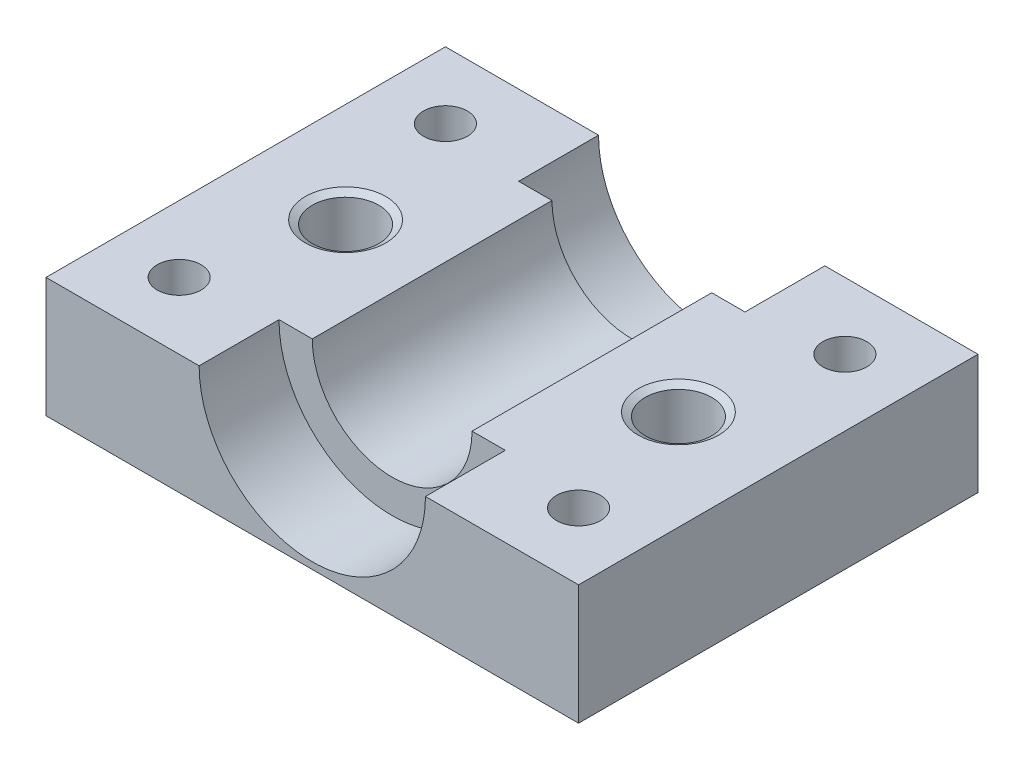
ISO-10303-21;
HEADER;
FILE_DESCRIPTION(('STEP AP214'),'2;1');
FILE_NAME('part.step','',(''),(''),'','','');
FILE_SCHEMA(('AUTOMOTIVE_DESIGN { 1 0 10303 214 1 1 1 1 }'));
ENDSEC;
DATA;
#1=APPLICATION_CONTEXT('core data for automotive mechanical design processes');
#2=APPLICATION_PROTOCOL_DEFINITION('international standard','automotive_design',2000,#1);
#3=PRODUCT_CONTEXT('',#1,'mechanical');
#4=PRODUCT('Part','Part','',(#3));
#5=PRODUCT_RELATED_PRODUCT_CATEGORY('part','',(#4));
#6=PRODUCT_DEFINITION_FORMATION('','',#4);
#7=PRODUCT_DEFINITION_CONTEXT('part definition',#1,'design');
#8=PRODUCT_DEFINITION('design','',#6,#7);
#9=PRODUCT_DEFINITION_SHAPE('','',#8);
#10=(LENGTH_UNIT() NAMED_UNIT(*) SI_UNIT(.MILLI.,.METRE.));
#11=(NAMED_UNIT(*) PLANE_ANGLE_UNIT() SI_UNIT($,.RADIAN.));
#12=(NAMED_UNIT(*) SI_UNIT($,.STERADIAN.) SOLID_ANGLE_UNIT());
#13=UNCERTAINTY_MEASURE_WITH_UNIT(LENGTH_MEASURE(1.E-05),#10,'distance_accuracy_value','');
#14=(GEOMETRIC_REPRESENTATION_CONTEXT(3) GLOBAL_UNCERTAINTY_ASSIGNED_CONTEXT((#13)) GLOBAL_UNIT_ASSIGNED_CONTEXT((#10,
#11,#12)) REPRESENTATION_CONTEXT('',''));
#15=CARTESIAN_POINT('',(0.,0.,0.));
#16=DIRECTION('',(0.,0.,1.));
#17=DIRECTION('',(1.,0.,0.));
#18=AXIS2_PLACEMENT_3D('',#15,#16,#17);
#19=CARTESIAN_POINT('',(20.,9.,-6.));
#20=DIRECTION('',(0.,0.,1.));
#21=DIRECTION('',(1.,0.,0.));
#22=AXIS2_PLACEMENT_3D('',#19,#20,#21);
#23=CYLINDRICAL_SURFACE('',#22,8.5);
#24=DIRECTION('',(0.,0.,1.));
#25=VECTOR('',#24,1.);
#26=CARTESIAN_POINT('',(11.5,9.,-6.));
#27=LINE('',#26,#25);
#28=CARTESIAN_POINT('',(11.5,9.,-6.));
#29=VERTEX_POINT('',#28);
#30=CARTESIAN_POINT('',(11.5,9.00000000000001,0.));
#31=VERTEX_POINT('',#30);
#32=EDGE_CURVE('E50',#29,#31,#27,.T.);
#33=ORIENTED_EDGE('',*,*,#32,.T.);
#34=CARTESIAN_POINT('',(20.,9.,0.));
#35=DIRECTION('',(0.,0.,1.));
#36=DIRECTION('',(1.,0.,0.));
#37=AXIS2_PLACEMENT_3D('',#34,#35,#36);
#38=CIRCLE('',#37,8.5);
#39=CARTESIAN_POINT('',(28.5,9.,0.));
#40=VERTEX_POINT('',#39);
#41=EDGE_CURVE('E143',#31,#40,#38,.T.);
#42=ORIENTED_EDGE('',*,*,#41,.T.);
#43=DIRECTION('',(0.,0.,1.));
#44=VECTOR('',#43,1.);
#45=CARTESIAN_POINT('',(28.5,9.,-6.));
#46=LINE('',#45,#44);
#47=CARTESIAN_POINT('',(28.5,9.,-6.));
#48=VERTEX_POINT('',#47);
#49=EDGE_CURVE('E191',#48,#40,#46,.T.);
#50=ORIENTED_EDGE('',*,*,#49,.F.);
#51=CARTESIAN_POINT('',(20.,9.,-6.));
#52=DIRECTION('',(0.,0.,-1.));
#53=DIRECTION('',(1.,0.,0.));
#54=AXIS2_PLACEMENT_3D('',#51,#52,#53);
#55=CIRCLE('',#54,8.5);
#56=EDGE_CURVE('E181',#48,#29,#55,.T.);
#57=ORIENTED_EDGE('',*,*,#56,.T.);
#58=EDGE_LOOP('',(#33,#42,#50,#57));
#59=FACE_BOUND('',#58,.T.);
#60=ADVANCED_FACE('F41',(#59),#23,.F.);
#61=CARTESIAN_POINT('',(0.,0.,-6.));
#62=DIRECTION('',(-1.,0.,0.));
#63=DIRECTION('',(0.,0.,1.));
#64=AXIS2_PLACEMENT_3D('',#61,#62,#63);
#65=PLANE('',#64);
#66=DIRECTION('',(0.,0.,1.));
#67=VECTOR('',#66,1.);
#68=CARTESIAN_POINT('',(0.,0.,-6.));
#69=LINE('',#68,#67);
#70=CARTESIAN_POINT('',(0.,0.,-6.));
#71=VERTEX_POINT('',#70);
#72=CARTESIAN_POINT('',(0.,0.,24.));
#73=VERTEX_POINT('',#72);
#74=EDGE_CURVE('E186',#71,#73,#69,.T.);
#75=ORIENTED_EDGE('',*,*,#74,.T.);
#76=DIRECTION('',(0.,-1.,0.));
#77=VECTOR('',#76,1.);
#78=CARTESIAN_POINT('',(0.,0.,24.));
#79=LINE('',#78,#77);
#80=CARTESIAN_POINT('',(0.,9.,24.));
#81=VERTEX_POINT('',#80);
#82=EDGE_CURVE('E132',#81,#73,#79,.T.);
#83=ORIENTED_EDGE('',*,*,#82,.F.);
#84=DIRECTION('',(0.,0.,1.));
#85=VECTOR('',#84,1.);
#86=CARTESIAN_POINT('',(0.,9.,-6.));
#87=LINE('',#86,#85);
#88=CARTESIAN_POINT('',(0.,9.,-6.));
#89=VERTEX_POINT('',#88);
#90=EDGE_CURVE('E11',#89,#81,#87,.T.);
#91=ORIENTED_EDGE('',*,*,#90,.F.);
#92=DIRECTION('',(0.,-1.,0.));
#93=VECTOR('',#92,1.);
#94=CARTESIAN_POINT('',(0.,0.,-6.));
#95=LINE('',#94,#93);
#96=EDGE_CURVE('E170',#89,#71,#95,.T.);
#97=ORIENTED_EDGE('',*,*,#96,.T.);
#98=EDGE_LOOP('',(#75,#83,#91,#97));
#99=FACE_BOUND('',#98,.T.);
#100=ADVANCED_FACE('F43',(#99),#65,.T.);
#101=CARTESIAN_POINT('',(0.,9.,-6.));
#102=DIRECTION('',(0.,1.,0.));
#103=DIRECTION('',(0.,0.,1.));
#104=AXIS2_PLACEMENT_3D('',#101,#102,#103);
#105=PLANE('',#104);
#106=CARTESIAN_POINT('',(7.5,9.,9.00000000000001));
#107=DIRECTION('',(0.,1.,0.));
#108=DIRECTION('',(0.,0.,1.));
#109=AXIS2_PLACEMENT_3D('',#106,#107,#108);
#110=CIRCLE('',#109,3.025);
#111=CARTESIAN_POINT('',(7.5,9.,12.025));
#112=VERTEX_POINT('',#111);
#113=EDGE_CURVE('E225',#112,#112,#110,.T.);
#114=ORIENTED_EDGE('',*,*,#113,.F.);
#115=EDGE_LOOP('',(#114));
#116=FACE_BOUND('',#115,.T.);
#117=CARTESIAN_POINT('',(5.,9.,19.));
#118=DIRECTION('',(0.,1.,0.));
#119=DIRECTION('',(0.,0.,1.));
#120=AXIS2_PLACEMENT_3D('',#117,#118,#119);
#121=CIRCLE('',#120,1.65);
#122=CARTESIAN_POINT('',(5.,9.,20.65));
#123=VERTEX_POINT('',#122);
#124=EDGE_CURVE('E202',#123,#123,#121,.T.);
#125=ORIENTED_EDGE('',*,*,#124,.F.);
#126=EDGE_LOOP('',(#125));
#127=FACE_BOUND('',#126,.T.);
#128=CARTESIAN_POINT('',(5.,9.,-1.));
#129=DIRECTION('',(0.,1.,0.));
#130=DIRECTION('',(0.,0.,1.));
#131=AXIS2_PLACEMENT_3D('',#128,#129,#130);
#132=CIRCLE('',#131,1.65);
#133=CARTESIAN_POINT('',(5.,9.,0.649999999999993));
#134=VERTEX_POINT('',#133);
#135=EDGE_CURVE('E146',#134,#134,#132,.T.);
#136=ORIENTED_EDGE('',*,*,#135,.F.);
#137=EDGE_LOOP('',(#136));
#138=FACE_BOUND('',#137,.T.);
#139=ORIENTED_EDGE('',*,*,#90,.T.);
#140=DIRECTION('',(-1.,0.,0.));
#141=VECTOR('',#140,1.);
#142=CARTESIAN_POINT('',(0.,9.,24.));
#143=LINE('',#142,#141);
#144=CARTESIAN_POINT('',(11.5,9.,24.));
#145=VERTEX_POINT('',#144);
#146=EDGE_CURVE('E167',#145,#81,#143,.T.);
#147=ORIENTED_EDGE('',*,*,#146,.F.);
#148=CARTESIAN_POINT('',(11.5,9.00000000000001,18.));
#149=VERTEX_POINT('',#148);
#150=EDGE_CURVE('E190',#149,#145,#27,.T.);
#151=ORIENTED_EDGE('',*,*,#150,.F.);
#152=DIRECTION('',(-1.,0.,0.));
#153=VECTOR('',#152,1.);
#154=CARTESIAN_POINT('',(11.5,9.00000000000001,18.));
#155=LINE('',#154,#153);
#156=CARTESIAN_POINT('',(14.,9.,18.));
#157=VERTEX_POINT('',#156);
#158=EDGE_CURVE('E138',#157,#149,#155,.T.);
#159=ORIENTED_EDGE('',*,*,#158,.F.);
#160=DIRECTION('',(0.,0.,-1.));
#161=VECTOR('',#160,1.);
#162=CARTESIAN_POINT('',(14.,9.,18.));
#163=LINE('',#162,#161);
#164=CARTESIAN_POINT('',(14.,9.,0.));
#165=VERTEX_POINT('',#164);
#166=EDGE_CURVE('E133',#157,#165,#163,.T.);
#167=ORIENTED_EDGE('',*,*,#166,.T.);
#168=DIRECTION('',(-1.,0.,0.));
#169=VECTOR('',#168,1.);
#170=CARTESIAN_POINT('',(11.5,9.00000000000001,0.));
#171=LINE('',#170,#169);
#172=EDGE_CURVE('E150',#165,#31,#171,.T.);
#173=ORIENTED_EDGE('',*,*,#172,.T.);
#174=ORIENTED_EDGE('',*,*,#32,.F.);
#175=DIRECTION('',(-1.,0.,0.));
#176=VECTOR('',#175,1.);
#177=CARTESIAN_POINT('',(0.,9.,-6.));
#178=LINE('',#177,#176);
#179=EDGE_CURVE('E184',#29,#89,#178,.T.);
#180=ORIENTED_EDGE('',*,*,#179,.T.);
#181=EDGE_LOOP('',(#139,#147,#151,#159,#167,#173,#174,#180));
#182=FACE_BOUND('',#181,.T.);
#183=ADVANCED_FACE('F281',(#116,#127,#138,#182),#105,.T.);
#184=CARTESIAN_POINT('',(20.,9.,18.));
#185=DIRECTION('',(0.,0.,1.));
#186=DIRECTION('',(1.,0.,0.));
#187=AXIS2_PLACEMENT_3D('',#184,#185,#186);
#188=CIRCLE('',#187,8.5);
#189=CARTESIAN_POINT('',(28.5,9.,18.));
#190=VERTEX_POINT('',#189);
#191=EDGE_CURVE('E58',#149,#190,#188,.T.);
#192=ORIENTED_EDGE('',*,*,#191,.F.);
#193=ORIENTED_EDGE('',*,*,#150,.T.);
#194=CARTESIAN_POINT('',(20.,9.,24.));
#195=DIRECTION('',(0.,0.,-1.));
#196=DIRECTION('',(1.,0.,0.));
#197=AXIS2_PLACEMENT_3D('',#194,#195,#196);
#198=CIRCLE('',#197,8.5);
#199=CARTESIAN_POINT('',(28.5,9.,24.));
#200=VERTEX_POINT('',#199);
#201=EDGE_CURVE('E164',#200,#145,#198,.T.);
#202=ORIENTED_EDGE('',*,*,#201,.F.);
#203=EDGE_CURVE('E193',#190,#200,#46,.T.);
#204=ORIENTED_EDGE('',*,*,#203,.F.);
#205=EDGE_LOOP('',(#192,#193,#202,#204));
#206=FACE_BOUND('',#205,.T.);
#207=ADVANCED_FACE('F285',(#206),#23,.F.);
#208=CARTESIAN_POINT('',(28.5,9.,-6.));
#209=DIRECTION('',(0.,1.,0.));
#210=DIRECTION('',(-1.,0.,0.));
#211=AXIS2_PLACEMENT_3D('',#208,#209,#210);
#212=PLANE('',#211);
#213=CARTESIAN_POINT('',(32.5,9.00000000000001,9.));
#214=DIRECTION('',(0.,1.,0.));
#215=DIRECTION('',(0.,0.,1.));
#216=AXIS2_PLACEMENT_3D('',#213,#214,#215);
#217=CIRCLE('',#216,3.025);
#218=CARTESIAN_POINT('',(32.5,9.00000000000001,12.025));
#219=VERTEX_POINT('',#218);
#220=EDGE_CURVE('E310',#219,#219,#217,.T.);
#221=ORIENTED_EDGE('',*,*,#220,.F.);
#222=EDGE_LOOP('',(#221));
#223=FACE_BOUND('',#222,.T.);
#224=CARTESIAN_POINT('',(35.,9.00000000000001,19.));
#225=DIRECTION('',(0.,1.,0.));
#226=DIRECTION('',(-1.,0.,0.));
#227=AXIS2_PLACEMENT_3D('',#224,#225,#226);
#228=CIRCLE('',#227,1.65);
#229=CARTESIAN_POINT('',(33.35,9.00000000000001,19.));
#230=VERTEX_POINT('',#229);
#231=EDGE_CURVE('E212',#230,#230,#228,.T.);
#232=ORIENTED_EDGE('',*,*,#231,.F.);
#233=EDGE_LOOP('',(#232));
#234=FACE_BOUND('',#233,.T.);
#235=CARTESIAN_POINT('',(35.,9.00000000000001,-1.));
#236=DIRECTION('',(0.,1.,0.));
#237=DIRECTION('',(-1.,0.,0.));
#238=AXIS2_PLACEMENT_3D('',#235,#236,#237);
#239=CIRCLE('',#238,1.65);
#240=CARTESIAN_POINT('',(33.35,9.00000000000001,-1.));
#241=VERTEX_POINT('',#240);
#242=EDGE_CURVE('E207',#241,#241,#239,.T.);
#243=ORIENTED_EDGE('',*,*,#242,.F.);
#244=EDGE_LOOP('',(#243));
#245=FACE_BOUND('',#244,.T.);
#246=ORIENTED_EDGE('',*,*,#49,.T.);
#247=DIRECTION('',(-1.,0.,0.));
#248=VECTOR('',#247,1.);
#249=CARTESIAN_POINT('',(26.,9.,0.));
#250=LINE('',#249,#248);
#251=CARTESIAN_POINT('',(26.,9.,0.));
#252=VERTEX_POINT('',#251);
#253=EDGE_CURVE('E129',#40,#252,#250,.T.);
#254=ORIENTED_EDGE('',*,*,#253,.T.);
#255=DIRECTION('',(0.,0.,-1.));
#256=VECTOR('',#255,1.);
#257=CARTESIAN_POINT('',(26.,9.,18.));
#258=LINE('',#257,#256);
#259=CARTESIAN_POINT('',(26.,9.,18.));
#260=VERTEX_POINT('',#259);
#261=EDGE_CURVE('E126',#260,#252,#258,.T.);
#262=ORIENTED_EDGE('',*,*,#261,.F.);
#263=DIRECTION('',(-1.,0.,0.));
#264=VECTOR('',#263,1.);
#265=CARTESIAN_POINT('',(26.,9.,18.));
#266=LINE('',#265,#264);
#267=EDGE_CURVE('E116',#190,#260,#266,.T.);
#268=ORIENTED_EDGE('',*,*,#267,.F.);
#269=ORIENTED_EDGE('',*,*,#203,.T.);
#270=DIRECTION('',(-1.,0.,0.));
#271=VECTOR('',#270,1.);
#272=CARTESIAN_POINT('',(28.5,9.,24.));
#273=LINE('',#272,#271);
#274=CARTESIAN_POINT('',(40.,9.00000000000001,24.));
#275=VERTEX_POINT('',#274);
#276=EDGE_CURVE('E161',#275,#200,#273,.T.);
#277=ORIENTED_EDGE('',*,*,#276,.F.);
#278=DIRECTION('',(0.,0.,1.));
#279=VECTOR('',#278,1.);
#280=CARTESIAN_POINT('',(40.,9.00000000000001,-6.));
#281=LINE('',#280,#279);
#282=CARTESIAN_POINT('',(40.,9.00000000000001,-6.));
#283=VERTEX_POINT('',#282);
#284=EDGE_CURVE('E194',#283,#275,#281,.T.);
#285=ORIENTED_EDGE('',*,*,#284,.F.);
#286=DIRECTION('',(-1.,0.,0.));
#287=VECTOR('',#286,1.);
#288=CARTESIAN_POINT('',(28.5,9.,-6.));
#289=LINE('',#288,#287);
#290=EDGE_CURVE('E178',#283,#48,#289,.T.);
#291=ORIENTED_EDGE('',*,*,#290,.T.);
#292=EDGE_LOOP('',(#246,#254,#262,#268,#269,#277,#285,#291));
#293=FACE_BOUND('',#292,.T.);
#294=ADVANCED_FACE('F128',(#223,#234,#245,#293),#212,.T.);
#295=CARTESIAN_POINT('',(40.,0.,-6.));
#296=DIRECTION('',(1.,0.,0.));
#297=DIRECTION('',(0.,0.,-1.));
#298=AXIS2_PLACEMENT_3D('',#295,#296,#297);
#299=PLANE('',#298);
#300=ORIENTED_EDGE('',*,*,#284,.T.);
#301=DIRECTION('',(0.,1.,0.));
#302=VECTOR('',#301,1.);
#303=CARTESIAN_POINT('',(40.,0.,24.));
#304=LINE('',#303,#302);
#305=CARTESIAN_POINT('',(40.,0.,24.));
#306=VERTEX_POINT('',#305);
#307=EDGE_CURVE('E158',#306,#275,#304,.T.);
#308=ORIENTED_EDGE('',*,*,#307,.F.);
#309=DIRECTION('',(0.,0.,1.));
#310=VECTOR('',#309,1.);
#311=CARTESIAN_POINT('',(40.,0.,-6.));
#312=LINE('',#311,#310);
#313=CARTESIAN_POINT('',(40.,0.,-6.));
#314=VERTEX_POINT('',#313);
#315=EDGE_CURVE('E196',#314,#306,#312,.T.);
#316=ORIENTED_EDGE('',*,*,#315,.F.);
#317=DIRECTION('',(0.,1.,0.));
#318=VECTOR('',#317,1.);
#319=CARTESIAN_POINT('',(40.,0.,-6.));
#320=LINE('',#319,#318);
#321=EDGE_CURVE('E175',#314,#283,#320,.T.);
#322=ORIENTED_EDGE('',*,*,#321,.T.);
#323=EDGE_LOOP('',(#300,#308,#316,#322));
#324=FACE_BOUND('',#323,.T.);
#325=ADVANCED_FACE('F261',(#324),#299,.T.);
#326=CARTESIAN_POINT('',(0.,0.,-6.));
#327=DIRECTION('',(0.,-1.,0.));
#328=DIRECTION('',(1.,0.,0.));
#329=AXIS2_PLACEMENT_3D('',#326,#327,#328);
#330=PLANE('',#329);
#331=CARTESIAN_POINT('',(32.5,0.,9.));
#332=DIRECTION('',(0.,-1.,0.));
#333=DIRECTION('',(1.,0.,0.));
#334=AXIS2_PLACEMENT_3D('',#331,#332,#333);
#335=CIRCLE('',#334,2.5);
#336=CARTESIAN_POINT('',(35.,0.,9.));
#337=VERTEX_POINT('',#336);
#338=EDGE_CURVE('E45',#337,#337,#335,.T.);
#339=ORIENTED_EDGE('',*,*,#338,.F.);
#340=EDGE_LOOP('',(#339));
#341=FACE_BOUND('',#340,.T.);
#342=CARTESIAN_POINT('',(7.5,0.,9.00000000000001));
#343=DIRECTION('',(0.,-1.,0.));
#344=DIRECTION('',(1.,0.,0.));
#345=AXIS2_PLACEMENT_3D('',#342,#343,#344);
#346=CIRCLE('',#345,2.5);
#347=CARTESIAN_POINT('',(10.,0.,9.00000000000001));
#348=VERTEX_POINT('',#347);
#349=EDGE_CURVE('E216',#348,#348,#346,.T.);
#350=ORIENTED_EDGE('',*,*,#349,.F.);
#351=EDGE_LOOP('',(#350));
#352=FACE_BOUND('',#351,.T.);
#353=CARTESIAN_POINT('',(35.,0.,19.));
#354=DIRECTION('',(0.,-1.,0.));
#355=DIRECTION('',(0.,0.,-1.));
#356=AXIS2_PLACEMENT_3D('',#353,#354,#355);
#357=CIRCLE('',#356,2.025);
#358=CARTESIAN_POINT('',(35.,0.,16.975));
#359=VERTEX_POINT('',#358);
#360=EDGE_CURVE('E218',#359,#359,#357,.T.);
#361=ORIENTED_EDGE('',*,*,#360,.F.);
#362=EDGE_LOOP('',(#361));
#363=FACE_BOUND('',#362,.T.);
#364=CARTESIAN_POINT('',(35.,0.,-1.));
#365=DIRECTION('',(0.,-1.,0.));
#366=DIRECTION('',(0.,0.,-1.));
#367=AXIS2_PLACEMENT_3D('',#364,#365,#366);
#368=CIRCLE('',#367,2.025);
#369=CARTESIAN_POINT('',(35.,0.,-3.025));
#370=VERTEX_POINT('',#369);
#371=EDGE_CURVE('E214',#370,#370,#368,.T.);
#372=ORIENTED_EDGE('',*,*,#371,.F.);
#373=EDGE_LOOP('',(#372));
#374=FACE_BOUND('',#373,.T.);
#375=CARTESIAN_POINT('',(5.,0.,19.));
#376=DIRECTION('',(0.,-1.,0.));
#377=DIRECTION('',(0.,0.,-1.));
#378=AXIS2_PLACEMENT_3D('',#375,#376,#377);
#379=CIRCLE('',#378,2.025);
#380=CARTESIAN_POINT('',(5.,0.,16.975));
#381=VERTEX_POINT('',#380);
#382=EDGE_CURVE('E210',#381,#381,#379,.T.);
#383=ORIENTED_EDGE('',*,*,#382,.F.);
#384=EDGE_LOOP('',(#383));
#385=FACE_BOUND('',#384,.T.);
#386=CARTESIAN_POINT('',(5.,0.,-1.));
#387=DIRECTION('',(0.,-1.,0.));
#388=DIRECTION('',(0.,0.,-1.));
#389=AXIS2_PLACEMENT_3D('',#386,#387,#388);
#390=CIRCLE('',#389,2.025);
#391=CARTESIAN_POINT('',(5.,0.,-3.025));
#392=VERTEX_POINT('',#391);
#393=EDGE_CURVE('E205',#392,#392,#390,.T.);
#394=ORIENTED_EDGE('',*,*,#393,.F.);
#395=EDGE_LOOP('',(#394));
#396=FACE_BOUND('',#395,.T.);
#397=ORIENTED_EDGE('',*,*,#315,.T.);
#398=DIRECTION('',(1.,0.,0.));
#399=VECTOR('',#398,1.);
#400=CARTESIAN_POINT('',(0.,0.,24.));
#401=LINE('',#400,#399);
#402=EDGE_CURVE('E155',#73,#306,#401,.T.);
#403=ORIENTED_EDGE('',*,*,#402,.F.);
#404=ORIENTED_EDGE('',*,*,#74,.F.);
#405=DIRECTION('',(1.,0.,0.));
#406=VECTOR('',#405,1.);
#407=CARTESIAN_POINT('',(0.,0.,-6.));
#408=LINE('',#407,#406);
#409=EDGE_CURVE('E172',#71,#314,#408,.T.);
#410=ORIENTED_EDGE('',*,*,#409,.T.);
#411=EDGE_LOOP('',(#397,#403,#404,#410));
#412=FACE_BOUND('',#411,.T.);
#413=ADVANCED_FACE('F257',(#341,#352,#363,#374,#385,#396,#412),#330,.T.);
#414=CARTESIAN_POINT('',(20.,9.,-6.));
#415=DIRECTION('',(0.,0.,1.));
#416=DIRECTION('',(1.,0.,0.));
#417=AXIS2_PLACEMENT_3D('',#414,#415,#416);
#418=PLANE('',#417);
#419=ORIENTED_EDGE('',*,*,#96,.F.);
#420=ORIENTED_EDGE('',*,*,#179,.F.);
#421=ORIENTED_EDGE('',*,*,#56,.F.);
#422=ORIENTED_EDGE('',*,*,#290,.F.);
#423=ORIENTED_EDGE('',*,*,#321,.F.);
#424=ORIENTED_EDGE('',*,*,#409,.F.);
#425=EDGE_LOOP('',(#419,#420,#421,#422,#423,#424));
#426=FACE_BOUND('',#425,.T.);
#427=ADVANCED_FACE('F260',(#426),#418,.F.);
#428=CARTESIAN_POINT('',(20.,9.,24.));
#429=DIRECTION('',(0.,0.,1.));
#430=DIRECTION('',(1.,0.,0.));
#431=AXIS2_PLACEMENT_3D('',#428,#429,#430);
#432=PLANE('',#431);
#433=ORIENTED_EDGE('',*,*,#82,.T.);
#434=ORIENTED_EDGE('',*,*,#402,.T.);
#435=ORIENTED_EDGE('',*,*,#307,.T.);
#436=ORIENTED_EDGE('',*,*,#276,.T.);
#437=ORIENTED_EDGE('',*,*,#201,.T.);
#438=ORIENTED_EDGE('',*,*,#146,.T.);
#439=EDGE_LOOP('',(#433,#434,#435,#436,#437,#438));
#440=FACE_BOUND('',#439,.T.);
#441=ADVANCED_FACE('F269',(#440),#432,.T.);
#442=CARTESIAN_POINT('',(20.,9.,18.));
#443=DIRECTION('',(0.,0.,-1.));
#444=DIRECTION('',(-1.,0.,0.));
#445=AXIS2_PLACEMENT_3D('',#442,#443,#444);
#446=CYLINDRICAL_SURFACE('',#445,6.);
#447=CARTESIAN_POINT('',(20.,9.,0.));
#448=DIRECTION('',(0.,0.,-1.));
#449=DIRECTION('',(1.,0.,0.));
#450=AXIS2_PLACEMENT_3D('',#447,#448,#449);
#451=CIRCLE('',#450,6.);
#452=EDGE_CURVE('E148',#252,#165,#451,.T.);
#453=ORIENTED_EDGE('',*,*,#452,.T.);
#454=ORIENTED_EDGE('',*,*,#166,.F.);
#455=CARTESIAN_POINT('',(20.,9.,18.));
#456=DIRECTION('',(0.,0.,-1.));
#457=DIRECTION('',(1.,0.,0.));
#458=AXIS2_PLACEMENT_3D('',#455,#456,#457);
#459=CIRCLE('',#458,6.);
#460=EDGE_CURVE('E120',#260,#157,#459,.T.);
#461=ORIENTED_EDGE('',*,*,#460,.F.);
#462=ORIENTED_EDGE('',*,*,#261,.T.);
#463=EDGE_LOOP('',(#453,#454,#461,#462));
#464=FACE_BOUND('',#463,.T.);
#465=ADVANCED_FACE('F135',(#464),#446,.F.);
#466=CARTESIAN_POINT('',(20.,9.,18.));
#467=DIRECTION('',(0.,0.,1.));
#468=DIRECTION('',(1.,0.,0.));
#469=AXIS2_PLACEMENT_3D('',#466,#467,#468);
#470=PLANE('',#469);
#471=ORIENTED_EDGE('',*,*,#191,.T.);
#472=ORIENTED_EDGE('',*,*,#267,.T.);
#473=ORIENTED_EDGE('',*,*,#460,.T.);
#474=ORIENTED_EDGE('',*,*,#158,.T.);
#475=EDGE_LOOP('',(#471,#472,#473,#474));
#476=FACE_BOUND('',#475,.T.);
#477=ADVANCED_FACE('F118',(#476),#470,.T.);
#478=CARTESIAN_POINT('',(20.,9.,0.));
#479=DIRECTION('',(0.,0.,1.));
#480=DIRECTION('',(1.,0.,0.));
#481=AXIS2_PLACEMENT_3D('',#478,#479,#480);
#482=PLANE('',#481);
#483=ORIENTED_EDGE('',*,*,#41,.F.);
#484=ORIENTED_EDGE('',*,*,#172,.F.);
#485=ORIENTED_EDGE('',*,*,#452,.F.);
#486=ORIENTED_EDGE('',*,*,#253,.F.);
#487=EDGE_LOOP('',(#483,#484,#485,#486));
#488=FACE_BOUND('',#487,.T.);
#489=ADVANCED_FACE('F279',(#488),#482,.F.);
#490=CARTESIAN_POINT('',(5.,0.,-1.));
#491=DIRECTION('',(0.,-1.,0.));
#492=DIRECTION('',(0.,0.,-1.));
#493=AXIS2_PLACEMENT_3D('',#490,#491,#492);
#494=CYLINDRICAL_SURFACE('',#493,1.65);
#495=ORIENTED_EDGE('',*,*,#135,.T.);
#496=EDGE_LOOP('',(#495));
#497=FACE_BOUND('',#496,.T.);
#498=CARTESIAN_POINT('',(5.,0.216506350946112,-1.));
#499=DIRECTION('',(0.,-1.,0.));
#500=DIRECTION('',(0.,0.,-1.));
#501=AXIS2_PLACEMENT_3D('',#498,#499,#500);
#502=CIRCLE('',#501,1.65);
#503=CARTESIAN_POINT('',(5.,0.216506350946112,-2.65));
#504=VERTEX_POINT('',#503);
#505=EDGE_CURVE('E201',#504,#504,#502,.T.);
#506=ORIENTED_EDGE('',*,*,#505,.T.);
#507=EDGE_LOOP('',(#506));
#508=FACE_BOUND('',#507,.T.);
#509=ADVANCED_FACE('F248',(#497,#508),#494,.F.);
#510=CARTESIAN_POINT('',(5.,0.,-1.));
#511=DIRECTION('',(0.,-1.,0.));
#512=DIRECTION('',(0.,0.,-1.));
#513=AXIS2_PLACEMENT_3D('',#510,#511,#512);
#514=CONICAL_SURFACE('',#513,2.025,1.0471975511966);
#515=ORIENTED_EDGE('',*,*,#505,.F.);
#516=EDGE_LOOP('',(#515));
#517=FACE_BOUND('',#516,.T.);
#518=ORIENTED_EDGE('',*,*,#393,.T.);
#519=EDGE_LOOP('',(#518));
#520=FACE_BOUND('',#519,.T.);
#521=ADVANCED_FACE('F250',(#517,#520),#514,.F.);
#522=CARTESIAN_POINT('',(5.,0.,19.));
#523=DIRECTION('',(0.,-1.,0.));
#524=DIRECTION('',(0.,0.,-1.));
#525=AXIS2_PLACEMENT_3D('',#522,#523,#524);
#526=CYLINDRICAL_SURFACE('',#525,1.65);
#527=ORIENTED_EDGE('',*,*,#124,.T.);
#528=EDGE_LOOP('',(#527));
#529=FACE_BOUND('',#528,.T.);
#530=CARTESIAN_POINT('',(5.,0.216506350946112,19.));
#531=DIRECTION('',(0.,-1.,0.));
#532=DIRECTION('',(0.,0.,-1.));
#533=AXIS2_PLACEMENT_3D('',#530,#531,#532);
#534=CIRCLE('',#533,1.65);
#535=CARTESIAN_POINT('',(5.,0.216506350946112,17.35));
#536=VERTEX_POINT('',#535);
#537=EDGE_CURVE('E206',#536,#536,#534,.T.);
#538=ORIENTED_EDGE('',*,*,#537,.T.);
#539=EDGE_LOOP('',(#538));
#540=FACE_BOUND('',#539,.T.);
#541=ADVANCED_FACE('F253',(#529,#540),#526,.F.);
#542=CARTESIAN_POINT('',(5.,0.,19.));
#543=DIRECTION('',(0.,-1.,0.));
#544=DIRECTION('',(0.,0.,-1.));
#545=AXIS2_PLACEMENT_3D('',#542,#543,#544);
#546=CONICAL_SURFACE('',#545,2.025,1.0471975511966);
#547=ORIENTED_EDGE('',*,*,#537,.F.);
#548=EDGE_LOOP('',(#547));
#549=FACE_BOUND('',#548,.T.);
#550=ORIENTED_EDGE('',*,*,#382,.T.);
#551=EDGE_LOOP('',(#550));
#552=FACE_BOUND('',#551,.T.);
#553=ADVANCED_FACE('F319',(#549,#552),#546,.F.);
#554=CARTESIAN_POINT('',(35.,0.,-1.));
#555=DIRECTION('',(0.,-1.,0.));
#556=DIRECTION('',(0.,0.,-1.));
#557=AXIS2_PLACEMENT_3D('',#554,#555,#556);
#558=CYLINDRICAL_SURFACE('',#557,1.65);
#559=ORIENTED_EDGE('',*,*,#242,.T.);
#560=EDGE_LOOP('',(#559));
#561=FACE_BOUND('',#560,.T.);
#562=CARTESIAN_POINT('',(35.,0.216506350946117,-1.));
#563=DIRECTION('',(0.,-1.,0.));
#564=DIRECTION('',(0.,0.,-1.));
#565=AXIS2_PLACEMENT_3D('',#562,#563,#564);
#566=CIRCLE('',#565,1.65);
#567=CARTESIAN_POINT('',(35.,0.216506350946117,-2.65));
#568=VERTEX_POINT('',#567);
#569=EDGE_CURVE('E211',#568,#568,#566,.T.);
#570=ORIENTED_EDGE('',*,*,#569,.T.);
#571=EDGE_LOOP('',(#570));
#572=FACE_BOUND('',#571,.T.);
#573=ADVANCED_FACE('F315',(#561,#572),#558,.F.);
#574=CARTESIAN_POINT('',(35.,0.,-1.));
#575=DIRECTION('',(0.,-1.,0.));
#576=DIRECTION('',(0.,0.,-1.));
#577=AXIS2_PLACEMENT_3D('',#574,#575,#576);
#578=CONICAL_SURFACE('',#577,2.025,1.0471975511966);
#579=ORIENTED_EDGE('',*,*,#569,.F.);
#580=EDGE_LOOP('',(#579));
#581=FACE_BOUND('',#580,.T.);
#582=ORIENTED_EDGE('',*,*,#371,.T.);
#583=EDGE_LOOP('',(#582));
#584=FACE_BOUND('',#583,.T.);
#585=ADVANCED_FACE('F318',(#581,#584),#578,.F.);
#586=CARTESIAN_POINT('',(35.,0.,19.));
#587=DIRECTION('',(0.,-1.,0.));
#588=DIRECTION('',(0.,0.,-1.));
#589=AXIS2_PLACEMENT_3D('',#586,#587,#588);
#590=CYLINDRICAL_SURFACE('',#589,1.65);
#591=ORIENTED_EDGE('',*,*,#231,.T.);
#592=EDGE_LOOP('',(#591));
#593=FACE_BOUND('',#592,.T.);
#594=CARTESIAN_POINT('',(35.,0.216506350946117,19.));
#595=DIRECTION('',(0.,-1.,0.));
#596=DIRECTION('',(0.,0.,-1.));
#597=AXIS2_PLACEMENT_3D('',#594,#595,#596);
#598=CIRCLE('',#597,1.65);
#599=CARTESIAN_POINT('',(35.,0.216506350946117,17.35));
#600=VERTEX_POINT('',#599);
#601=EDGE_CURVE('E215',#600,#600,#598,.T.);
#602=ORIENTED_EDGE('',*,*,#601,.T.);
#603=EDGE_LOOP('',(#602));
#604=FACE_BOUND('',#603,.T.);
#605=ADVANCED_FACE('F325',(#593,#604),#590,.F.);
#606=CARTESIAN_POINT('',(35.,0.,19.));
#607=DIRECTION('',(0.,-1.,0.));
#608=DIRECTION('',(0.,0.,-1.));
#609=AXIS2_PLACEMENT_3D('',#606,#607,#608);
#610=CONICAL_SURFACE('',#609,2.025,1.0471975511966);
#611=ORIENTED_EDGE('',*,*,#601,.F.);
#612=EDGE_LOOP('',(#611));
#613=FACE_BOUND('',#612,.T.);
#614=ORIENTED_EDGE('',*,*,#360,.T.);
#615=EDGE_LOOP('',(#614));
#616=FACE_BOUND('',#615,.T.);
#617=ADVANCED_FACE('F403',(#613,#616),#610,.F.);
#618=CARTESIAN_POINT('',(7.5,9.,9.00000000000001));
#619=DIRECTION('',(0.,1.,0.));
#620=DIRECTION('',(0.,0.,1.));
#621=AXIS2_PLACEMENT_3D('',#618,#619,#620);
#622=CYLINDRICAL_SURFACE('',#621,2.5);
#623=ORIENTED_EDGE('',*,*,#349,.T.);
#624=EDGE_LOOP('',(#623));
#625=FACE_BOUND('',#624,.T.);
#626=CARTESIAN_POINT('',(7.5,8.69689110867544,9.00000000000001));
#627=DIRECTION('',(0.,1.,0.));
#628=DIRECTION('',(0.,0.,1.));
#629=AXIS2_PLACEMENT_3D('',#626,#627,#628);
#630=CIRCLE('',#629,2.5);
#631=CARTESIAN_POINT('',(7.5,8.69689110867544,11.5));
#632=VERTEX_POINT('',#631);
#633=EDGE_CURVE('E219',#632,#632,#630,.T.);
#634=ORIENTED_EDGE('',*,*,#633,.T.);
#635=EDGE_LOOP('',(#634));
#636=FACE_BOUND('',#635,.T.);
#637=ADVANCED_FACE('F410',(#625,#636),#622,.F.);
#638=CARTESIAN_POINT('',(7.5,9.,9.00000000000001));
#639=DIRECTION('',(0.,1.,0.));
#640=DIRECTION('',(0.,0.,1.));
#641=AXIS2_PLACEMENT_3D('',#638,#639,#640);
#642=CONICAL_SURFACE('',#641,3.025,1.0471975511966);
#643=ORIENTED_EDGE('',*,*,#633,.F.);
#644=EDGE_LOOP('',(#643));
#645=FACE_BOUND('',#644,.T.);
#646=ORIENTED_EDGE('',*,*,#113,.T.);
#647=EDGE_LOOP('',(#646));
#648=FACE_BOUND('',#647,.T.);
#649=ADVANCED_FACE('F415',(#645,#648),#642,.F.);
#650=CARTESIAN_POINT('',(32.5,9.00000000000001,9.));
#651=DIRECTION('',(0.,1.,0.));
#652=DIRECTION('',(0.,0.,1.));
#653=AXIS2_PLACEMENT_3D('',#650,#651,#652);
#654=CYLINDRICAL_SURFACE('',#653,2.5);
#655=ORIENTED_EDGE('',*,*,#338,.T.);
#656=EDGE_LOOP('',(#655));
#657=FACE_BOUND('',#656,.T.);
#658=CARTESIAN_POINT('',(32.5,8.69689110867545,9.));
#659=DIRECTION('',(0.,1.,0.));
#660=DIRECTION('',(0.,0.,1.));
#661=AXIS2_PLACEMENT_3D('',#658,#659,#660);
#662=CIRCLE('',#661,2.5);
#663=CARTESIAN_POINT('',(32.5,8.69689110867545,11.5));
#664=VERTEX_POINT('',#663);
#665=EDGE_CURVE('E555',#664,#664,#662,.T.);
#666=ORIENTED_EDGE('',*,*,#665,.T.);
#667=EDGE_LOOP('',(#666));
#668=FACE_BOUND('',#667,.T.);
#669=ADVANCED_FACE('F422',(#657,#668),#654,.F.);
#670=CARTESIAN_POINT('',(32.5,9.00000000000001,9.));
#671=DIRECTION('',(0.,1.,0.));
#672=DIRECTION('',(0.,0.,1.));
#673=AXIS2_PLACEMENT_3D('',#670,#671,#672);
#674=CONICAL_SURFACE('',#673,3.025,1.0471975511966);
#675=ORIENTED_EDGE('',*,*,#665,.F.);
#676=EDGE_LOOP('',(#675));
#677=FACE_BOUND('',#676,.T.);
#678=ORIENTED_EDGE('',*,*,#220,.T.);
#679=EDGE_LOOP('',(#678));
#680=FACE_BOUND('',#679,.T.);
#681=ADVANCED_FACE('F425',(#677,#680),#674,.F.);
#682=CLOSED_SHELL('',(#60,#100,#183,#207,#294,#325,#413,#427,#441,#465,#477,#489,#509,#521,#541,
#553,#573,#585,#605,#617,#637,#649,#669,#681));
#683=MANIFOLD_SOLID_BREP('B2',#682);
#684=ADVANCED_BREP_SHAPE_REPRESENTATION('',(#18,#683),#14);
#685=SHAPE_DEFINITION_REPRESENTATION(#9,#684);
ENDSEC;
END-ISO-10303-21;
